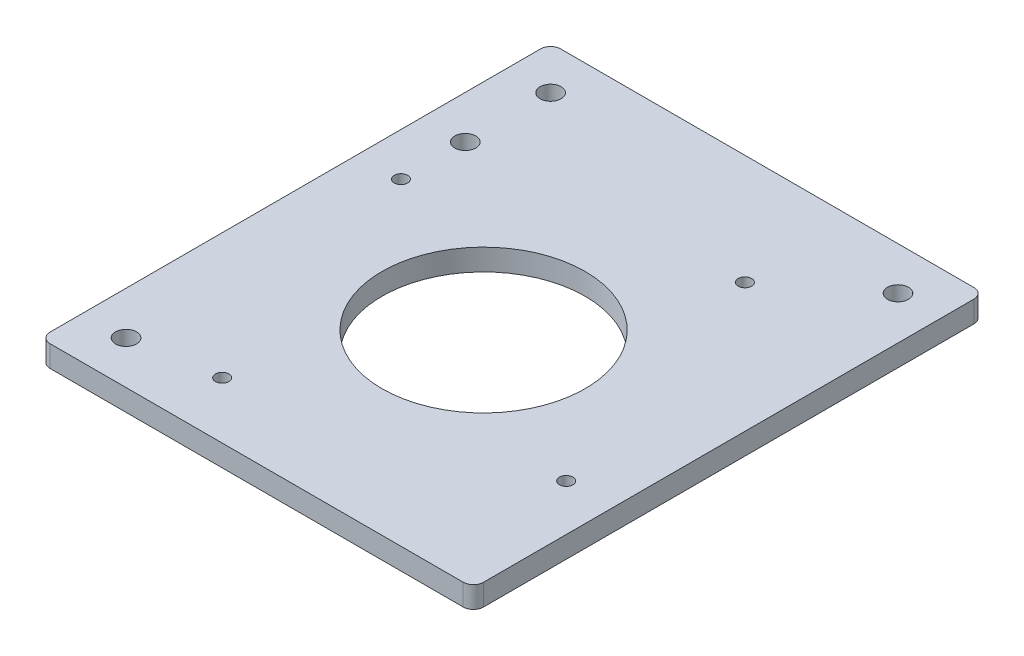
ISO-10303-21;
HEADER;
FILE_DESCRIPTION(('STEP AP214'),'2;1');
FILE_NAME('part.step','',(''),(''),'','','');
FILE_SCHEMA(('AUTOMOTIVE_DESIGN { 1 0 10303 214 1 1 1 1 }'));
ENDSEC;
DATA;
#1=APPLICATION_CONTEXT('core data for automotive mechanical design processes');
#2=APPLICATION_PROTOCOL_DEFINITION('international standard','automotive_design',2000,#1);
#3=PRODUCT_CONTEXT('',#1,'mechanical');
#4=PRODUCT('Part','Part','',(#3));
#5=PRODUCT_RELATED_PRODUCT_CATEGORY('part','',(#4));
#6=PRODUCT_DEFINITION_FORMATION('','',#4);
#7=PRODUCT_DEFINITION_CONTEXT('part definition',#1,'design');
#8=PRODUCT_DEFINITION('design','',#6,#7);
#9=PRODUCT_DEFINITION_SHAPE('','',#8);
#10=(LENGTH_UNIT() NAMED_UNIT(*) SI_UNIT(.MILLI.,.METRE.));
#11=(NAMED_UNIT(*) PLANE_ANGLE_UNIT() SI_UNIT($,.RADIAN.));
#12=(NAMED_UNIT(*) SI_UNIT($,.STERADIAN.) SOLID_ANGLE_UNIT());
#13=UNCERTAINTY_MEASURE_WITH_UNIT(LENGTH_MEASURE(1.E-05),#10,'distance_accuracy_value','');
#14=(GEOMETRIC_REPRESENTATION_CONTEXT(3) GLOBAL_UNCERTAINTY_ASSIGNED_CONTEXT((#13)) GLOBAL_UNIT_ASSIGNED_CONTEXT((#10,
#11,#12)) REPRESENTATION_CONTEXT('',''));
#15=CARTESIAN_POINT('',(0.,0.,0.));
#16=DIRECTION('',(0.,0.,1.));
#17=DIRECTION('',(1.,0.,0.));
#18=AXIS2_PLACEMENT_3D('',#15,#16,#17);
#19=CARTESIAN_POINT('',(0.,6.35,0.));
#20=DIRECTION('',(0.,1.,0.));
#21=DIRECTION('',(0.,0.,1.));
#22=AXIS2_PLACEMENT_3D('',#19,#20,#21);
#23=PLANE('',#22);
#24=CARTESIAN_POINT('',(103.020909069294,6.35,502.462051650958));
#25=DIRECTION('',(0.,1.,0.));
#26=DIRECTION('',(0.,0.,1.));
#27=AXIS2_PLACEMENT_3D('',#24,#25,#26);
#28=CIRCLE('',#27,1.985);
#29=CARTESIAN_POINT('',(103.020909069294,6.35,504.447051650958));
#30=VERTEX_POINT('',#29);
#31=EDGE_CURVE('E233',#30,#30,#28,.T.);
#32=ORIENTED_EDGE('',*,*,#31,.F.);
#33=EDGE_LOOP('',(#32));
#34=FACE_BOUND('',#33,.T.);
#35=CARTESIAN_POINT('',(127.427334093555,6.35,579.6556266267));
#36=DIRECTION('',(0.,1.,0.));
#37=DIRECTION('',(0.,0.,1.));
#38=AXIS2_PLACEMENT_3D('',#35,#36,#37);
#39=CIRCLE('',#38,1.985);
#40=CARTESIAN_POINT('',(127.427334093555,6.35,581.6406266267));
#41=VERTEX_POINT('',#40);
#42=EDGE_CURVE('E230',#41,#41,#39,.T.);
#43=ORIENTED_EDGE('',*,*,#42,.F.);
#44=EDGE_LOOP('',(#43));
#45=FACE_BOUND('',#44,.T.);
#46=CARTESIAN_POINT('',(50.2337591178136,6.35,604.06205165096));
#47=DIRECTION('',(0.,1.,0.));
#48=DIRECTION('',(0.,0.,1.));
#49=AXIS2_PLACEMENT_3D('',#46,#47,#48);
#50=CIRCLE('',#49,1.98500000000001);
#51=CARTESIAN_POINT('',(50.2337591178136,6.35,606.04705165096));
#52=VERTEX_POINT('',#51);
#53=EDGE_CURVE('E224',#52,#52,#50,.T.);
#54=ORIENTED_EDGE('',*,*,#53,.F.);
#55=EDGE_LOOP('',(#54));
#56=FACE_BOUND('',#55,.T.);
#57=CARTESIAN_POINT('',(25.8273340935529,6.35,526.868476675219));
#58=DIRECTION('',(0.,1.,0.));
#59=DIRECTION('',(0.,0.,1.));
#60=AXIS2_PLACEMENT_3D('',#57,#58,#59);
#61=CIRCLE('',#60,1.98500000000001);
#62=CARTESIAN_POINT('',(25.8273340935529,6.35,528.853476675219));
#63=VERTEX_POINT('',#62);
#64=EDGE_CURVE('E218',#63,#63,#61,.T.);
#65=ORIENTED_EDGE('',*,*,#64,.F.);
#66=EDGE_LOOP('',(#65));
#67=FACE_BOUND('',#66,.T.);
#68=CARTESIAN_POINT('',(25.8273340935529,6.35,608.062051650959));
#69=DIRECTION('',(0.,1.,0.));
#70=DIRECTION('',(0.,0.,1.));
#71=AXIS2_PLACEMENT_3D('',#68,#69,#70);
#72=CIRCLE('',#71,3.10000000000002);
#73=CARTESIAN_POINT('',(25.8273340935529,6.35,611.162051650959));
#74=VERTEX_POINT('',#73);
#75=EDGE_CURVE('E200',#74,#74,#72,.T.);
#76=ORIENTED_EDGE('',*,*,#75,.F.);
#77=EDGE_LOOP('',(#76));
#78=FACE_BOUND('',#77,.T.);
#79=CARTESIAN_POINT('',(25.8273340935529,6.35,482.662051650959));
#80=DIRECTION('',(0.,1.,0.));
#81=DIRECTION('',(0.,0.,1.));
#82=AXIS2_PLACEMENT_3D('',#79,#80,#81);
#83=CIRCLE('',#82,3.1);
#84=CARTESIAN_POINT('',(25.8273340935529,6.35,485.762051650959));
#85=VERTEX_POINT('',#84);
#86=EDGE_CURVE('E188',#85,#85,#83,.T.);
#87=ORIENTED_EDGE('',*,*,#86,.F.);
#88=EDGE_LOOP('',(#87));
#89=FACE_BOUND('',#88,.T.);
#90=DIRECTION('',(0.,0.,-1.));
#91=VECTOR('',#90,1.);
#92=CARTESIAN_POINT('',(141.127334093553,6.35,469.962051650959));
#93=LINE('',#92,#91);
#94=CARTESIAN_POINT('',(141.127334093553,6.35,617.762051650959));
#95=VERTEX_POINT('',#94);
#96=CARTESIAN_POINT('',(141.127334093553,6.35,472.962051650959));
#97=VERTEX_POINT('',#96);
#98=EDGE_CURVE('E145',#95,#97,#93,.T.);
#99=ORIENTED_EDGE('',*,*,#98,.T.);
#100=CARTESIAN_POINT('',(138.127334093553,6.35,472.962051650959));
#101=DIRECTION('',(0.,1.,0.));
#102=DIRECTION('',(0.,0.,1.));
#103=AXIS2_PLACEMENT_3D('',#100,#101,#102);
#104=CIRCLE('',#103,3.);
#105=CARTESIAN_POINT('',(138.127334093553,6.35,469.962051650959));
#106=VERTEX_POINT('',#105);
#107=EDGE_CURVE('E160',#97,#106,#104,.T.);
#108=ORIENTED_EDGE('',*,*,#107,.T.);
#109=DIRECTION('',(-1.,0.,0.));
#110=VECTOR('',#109,1.);
#111=CARTESIAN_POINT('',(13.127334093553,6.35,469.962051650959));
#112=LINE('',#111,#110);
#113=CARTESIAN_POINT('',(16.127334093553,6.35,469.962051650959));
#114=VERTEX_POINT('',#113);
#115=EDGE_CURVE('E127',#106,#114,#112,.T.);
#116=ORIENTED_EDGE('',*,*,#115,.T.);
#117=CARTESIAN_POINT('',(16.127334093553,6.35,472.962051650959));
#118=DIRECTION('',(0.,1.,0.));
#119=DIRECTION('',(0.,0.,1.));
#120=AXIS2_PLACEMENT_3D('',#117,#118,#119);
#121=CIRCLE('',#120,3.);
#122=CARTESIAN_POINT('',(13.127334093553,6.35,472.962051650959));
#123=VERTEX_POINT('',#122);
#124=EDGE_CURVE('E155',#114,#123,#121,.T.);
#125=ORIENTED_EDGE('',*,*,#124,.T.);
#126=DIRECTION('',(0.,0.,1.));
#127=VECTOR('',#126,1.);
#128=CARTESIAN_POINT('',(13.127334093553,6.35,469.962051650959));
#129=LINE('',#128,#127);
#130=CARTESIAN_POINT('',(13.127334093553,6.35,617.762051650959));
#131=VERTEX_POINT('',#130);
#132=EDGE_CURVE('E171',#123,#131,#129,.T.);
#133=ORIENTED_EDGE('',*,*,#132,.T.);
#134=CARTESIAN_POINT('',(16.127334093553,6.35,617.762051650959));
#135=DIRECTION('',(0.,1.,0.));
#136=DIRECTION('',(0.,0.,1.));
#137=AXIS2_PLACEMENT_3D('',#134,#135,#136);
#138=CIRCLE('',#137,3.);
#139=CARTESIAN_POINT('',(16.127334093553,6.35,620.762051650959));
#140=VERTEX_POINT('',#139);
#141=EDGE_CURVE('E63',#131,#140,#138,.T.);
#142=ORIENTED_EDGE('',*,*,#141,.T.);
#143=DIRECTION('',(1.,0.,0.));
#144=VECTOR('',#143,1.);
#145=CARTESIAN_POINT('',(13.127334093553,6.35,620.762051650959));
#146=LINE('',#145,#144);
#147=CARTESIAN_POINT('',(138.127334093553,6.35,620.762051650959));
#148=VERTEX_POINT('',#147);
#149=EDGE_CURVE('E146',#140,#148,#146,.T.);
#150=ORIENTED_EDGE('',*,*,#149,.T.);
#151=CARTESIAN_POINT('',(138.127334093553,6.35,617.762051650959));
#152=DIRECTION('',(0.,1.,0.));
#153=DIRECTION('',(0.,0.,1.));
#154=AXIS2_PLACEMENT_3D('',#151,#152,#153);
#155=CIRCLE('',#154,3.);
#156=EDGE_CURVE('E158',#148,#95,#155,.T.);
#157=ORIENTED_EDGE('',*,*,#156,.T.);
#158=EDGE_LOOP('',(#99,#108,#116,#125,#133,#142,#150,#157));
#159=FACE_BOUND('',#158,.T.);
#160=CARTESIAN_POINT('',(76.6273340935538,6.35,553.262051650959));
#161=DIRECTION('',(0.,1.,0.));
#162=DIRECTION('',(0.,0.,1.));
#163=AXIS2_PLACEMENT_3D('',#160,#161,#162);
#164=CIRCLE('',#163,30.);
#165=CARTESIAN_POINT('',(76.6273340935538,6.35,583.262051650959));
#166=VERTEX_POINT('',#165);
#167=EDGE_CURVE('E140',#166,#166,#164,.T.);
#168=ORIENTED_EDGE('',*,*,#167,.F.);
#169=EDGE_LOOP('',(#168));
#170=FACE_BOUND('',#169,.T.);
#171=CARTESIAN_POINT('',(128.427334093553,6.35,482.662051650959));
#172=DIRECTION('',(0.,1.,0.));
#173=DIRECTION('',(0.,0.,1.));
#174=AXIS2_PLACEMENT_3D('',#171,#172,#173);
#175=CIRCLE('',#174,3.09999999999999);
#176=CARTESIAN_POINT('',(128.427334093553,6.35,485.762051650959));
#177=VERTEX_POINT('',#176);
#178=EDGE_CURVE('E194',#177,#177,#175,.T.);
#179=ORIENTED_EDGE('',*,*,#178,.F.);
#180=EDGE_LOOP('',(#179));
#181=FACE_BOUND('',#180,.T.);
#182=CARTESIAN_POINT('',(25.8273340935529,6.35,507.862051650959));
#183=DIRECTION('',(0.,1.,0.));
#184=DIRECTION('',(0.,0.,1.));
#185=AXIS2_PLACEMENT_3D('',#182,#183,#184);
#186=CIRCLE('',#185,3.1);
#187=CARTESIAN_POINT('',(25.8273340935529,6.35,510.962051650959));
#188=VERTEX_POINT('',#187);
#189=EDGE_CURVE('E206',#188,#188,#186,.T.);
#190=ORIENTED_EDGE('',*,*,#189,.F.);
#191=EDGE_LOOP('',(#190));
#192=FACE_BOUND('',#191,.T.);
#193=ADVANCED_FACE('F41',(#34,#45,#56,#67,#78,#89,#159,#170,#181,#192),#23,.T.);
#194=CARTESIAN_POINT('',(0.,0.,0.));
#195=DIRECTION('',(0.,1.,0.));
#196=DIRECTION('',(0.,0.,1.));
#197=AXIS2_PLACEMENT_3D('',#194,#195,#196);
#198=PLANE('',#197);
#199=CARTESIAN_POINT('',(103.020909069294,0.,502.462051650958));
#200=DIRECTION('',(0.,1.,0.));
#201=DIRECTION('',(0.,0.,1.));
#202=AXIS2_PLACEMENT_3D('',#199,#200,#201);
#203=CIRCLE('',#202,1.985);
#204=CARTESIAN_POINT('',(103.020909069294,0.,504.447051650958));
#205=VERTEX_POINT('',#204);
#206=EDGE_CURVE('E212',#205,#205,#203,.T.);
#207=ORIENTED_EDGE('',*,*,#206,.T.);
#208=EDGE_LOOP('',(#207));
#209=FACE_BOUND('',#208,.T.);
#210=CARTESIAN_POINT('',(127.427334093555,0.,579.6556266267));
#211=DIRECTION('',(0.,1.,0.));
#212=DIRECTION('',(0.,0.,1.));
#213=AXIS2_PLACEMENT_3D('',#210,#211,#212);
#214=CIRCLE('',#213,1.985);
#215=CARTESIAN_POINT('',(127.427334093555,0.,581.6406266267));
#216=VERTEX_POINT('',#215);
#217=EDGE_CURVE('E227',#216,#216,#214,.T.);
#218=ORIENTED_EDGE('',*,*,#217,.T.);
#219=EDGE_LOOP('',(#218));
#220=FACE_BOUND('',#219,.T.);
#221=CARTESIAN_POINT('',(50.2337591178136,0.,604.06205165096));
#222=DIRECTION('',(0.,1.,0.));
#223=DIRECTION('',(0.,0.,1.));
#224=AXIS2_PLACEMENT_3D('',#221,#222,#223);
#225=CIRCLE('',#224,1.98500000000001);
#226=CARTESIAN_POINT('',(50.2337591178136,0.,606.04705165096));
#227=VERTEX_POINT('',#226);
#228=EDGE_CURVE('E221',#227,#227,#225,.T.);
#229=ORIENTED_EDGE('',*,*,#228,.T.);
#230=EDGE_LOOP('',(#229));
#231=FACE_BOUND('',#230,.T.);
#232=CARTESIAN_POINT('',(25.8273340935529,0.,526.868476675219));
#233=DIRECTION('',(0.,1.,0.));
#234=DIRECTION('',(0.,0.,1.));
#235=AXIS2_PLACEMENT_3D('',#232,#233,#234);
#236=CIRCLE('',#235,1.98500000000001);
#237=CARTESIAN_POINT('',(25.8273340935529,0.,528.853476675219));
#238=VERTEX_POINT('',#237);
#239=EDGE_CURVE('E215',#238,#238,#236,.T.);
#240=ORIENTED_EDGE('',*,*,#239,.T.);
#241=EDGE_LOOP('',(#240));
#242=FACE_BOUND('',#241,.T.);
#243=DIRECTION('',(-1.,0.,0.));
#244=VECTOR('',#243,1.);
#245=CARTESIAN_POINT('',(13.127334093553,0.,469.962051650959));
#246=LINE('',#245,#244);
#247=CARTESIAN_POINT('',(138.127334093553,0.,469.962051650959));
#248=VERTEX_POINT('',#247);
#249=CARTESIAN_POINT('',(16.127334093553,0.,469.962051650959));
#250=VERTEX_POINT('',#249);
#251=EDGE_CURVE('E124',#248,#250,#246,.T.);
#252=ORIENTED_EDGE('',*,*,#251,.F.);
#253=CARTESIAN_POINT('',(138.127334093553,0.,472.962051650959));
#254=DIRECTION('',(0.,1.,0.));
#255=DIRECTION('',(0.,0.,1.));
#256=AXIS2_PLACEMENT_3D('',#253,#254,#255);
#257=CIRCLE('',#256,3.);
#258=CARTESIAN_POINT('',(141.127334093553,0.,472.962051650959));
#259=VERTEX_POINT('',#258);
#260=EDGE_CURVE('E107',#248,#259,#257,.F.);
#261=ORIENTED_EDGE('',*,*,#260,.T.);
#262=DIRECTION('',(0.,0.,-1.));
#263=VECTOR('',#262,1.);
#264=CARTESIAN_POINT('',(141.127334093553,0.,469.962051650959));
#265=LINE('',#264,#263);
#266=CARTESIAN_POINT('',(141.127334093553,0.,617.762051650959));
#267=VERTEX_POINT('',#266);
#268=EDGE_CURVE('E135',#267,#259,#265,.T.);
#269=ORIENTED_EDGE('',*,*,#268,.F.);
#270=CARTESIAN_POINT('',(138.127334093553,0.,617.762051650959));
#271=DIRECTION('',(0.,1.,0.));
#272=DIRECTION('',(0.,0.,1.));
#273=AXIS2_PLACEMENT_3D('',#270,#271,#272);
#274=CIRCLE('',#273,3.);
#275=CARTESIAN_POINT('',(138.127334093553,0.,620.762051650959));
#276=VERTEX_POINT('',#275);
#277=EDGE_CURVE('E118',#267,#276,#274,.F.);
#278=ORIENTED_EDGE('',*,*,#277,.T.);
#279=DIRECTION('',(1.,0.,0.));
#280=VECTOR('',#279,1.);
#281=CARTESIAN_POINT('',(13.127334093553,0.,620.762051650959));
#282=LINE('',#281,#280);
#283=CARTESIAN_POINT('',(16.127334093553,0.,620.762051650959));
#284=VERTEX_POINT('',#283);
#285=EDGE_CURVE('E138',#284,#276,#282,.T.);
#286=ORIENTED_EDGE('',*,*,#285,.F.);
#287=CARTESIAN_POINT('',(16.127334093553,0.,617.762051650959));
#288=DIRECTION('',(0.,1.,0.));
#289=DIRECTION('',(0.,0.,1.));
#290=AXIS2_PLACEMENT_3D('',#287,#288,#289);
#291=CIRCLE('',#290,3.);
#292=CARTESIAN_POINT('',(13.127334093553,0.,617.762051650959));
#293=VERTEX_POINT('',#292);
#294=EDGE_CURVE('E149',#284,#293,#291,.F.);
#295=ORIENTED_EDGE('',*,*,#294,.T.);
#296=DIRECTION('',(0.,0.,1.));
#297=VECTOR('',#296,1.);
#298=CARTESIAN_POINT('',(13.127334093553,0.,469.962051650959));
#299=LINE('',#298,#297);
#300=CARTESIAN_POINT('',(13.127334093553,0.,472.962051650959));
#301=VERTEX_POINT('',#300);
#302=EDGE_CURVE('E134',#301,#293,#299,.T.);
#303=ORIENTED_EDGE('',*,*,#302,.F.);
#304=CARTESIAN_POINT('',(16.127334093553,0.,472.962051650959));
#305=DIRECTION('',(0.,1.,0.));
#306=DIRECTION('',(0.,0.,1.));
#307=AXIS2_PLACEMENT_3D('',#304,#305,#306);
#308=CIRCLE('',#307,3.);
#309=EDGE_CURVE('E128',#301,#250,#308,.F.);
#310=ORIENTED_EDGE('',*,*,#309,.T.);
#311=EDGE_LOOP('',(#252,#261,#269,#278,#286,#295,#303,#310));
#312=FACE_BOUND('',#311,.T.);
#313=CARTESIAN_POINT('',(76.6273340935538,0.,553.262051650959));
#314=DIRECTION('',(0.,1.,0.));
#315=DIRECTION('',(0.,0.,1.));
#316=AXIS2_PLACEMENT_3D('',#313,#314,#315);
#317=CIRCLE('',#316,30.);
#318=CARTESIAN_POINT('',(76.6273340935538,0.,583.262051650959));
#319=VERTEX_POINT('',#318);
#320=EDGE_CURVE('E185',#319,#319,#317,.T.);
#321=ORIENTED_EDGE('',*,*,#320,.T.);
#322=EDGE_LOOP('',(#321));
#323=FACE_BOUND('',#322,.T.);
#324=CARTESIAN_POINT('',(25.8273340935529,0.,482.662051650959));
#325=DIRECTION('',(0.,1.,0.));
#326=DIRECTION('',(0.,0.,1.));
#327=AXIS2_PLACEMENT_3D('',#324,#325,#326);
#328=CIRCLE('',#327,3.1);
#329=CARTESIAN_POINT('',(25.8273340935529,0.,485.762051650959));
#330=VERTEX_POINT('',#329);
#331=EDGE_CURVE('E191',#330,#330,#328,.T.);
#332=ORIENTED_EDGE('',*,*,#331,.T.);
#333=EDGE_LOOP('',(#332));
#334=FACE_BOUND('',#333,.T.);
#335=CARTESIAN_POINT('',(128.427334093553,0.,482.662051650959));
#336=DIRECTION('',(0.,1.,0.));
#337=DIRECTION('',(0.,0.,1.));
#338=AXIS2_PLACEMENT_3D('',#335,#336,#337);
#339=CIRCLE('',#338,3.09999999999999);
#340=CARTESIAN_POINT('',(128.427334093553,0.,485.762051650959));
#341=VERTEX_POINT('',#340);
#342=EDGE_CURVE('E197',#341,#341,#339,.T.);
#343=ORIENTED_EDGE('',*,*,#342,.T.);
#344=EDGE_LOOP('',(#343));
#345=FACE_BOUND('',#344,.T.);
#346=CARTESIAN_POINT('',(25.8273340935529,0.,608.062051650959));
#347=DIRECTION('',(0.,1.,0.));
#348=DIRECTION('',(0.,0.,1.));
#349=AXIS2_PLACEMENT_3D('',#346,#347,#348);
#350=CIRCLE('',#349,3.10000000000002);
#351=CARTESIAN_POINT('',(25.8273340935529,0.,611.162051650959));
#352=VERTEX_POINT('',#351);
#353=EDGE_CURVE('E203',#352,#352,#350,.T.);
#354=ORIENTED_EDGE('',*,*,#353,.T.);
#355=EDGE_LOOP('',(#354));
#356=FACE_BOUND('',#355,.T.);
#357=CARTESIAN_POINT('',(25.8273340935529,0.,507.862051650959));
#358=DIRECTION('',(0.,1.,0.));
#359=DIRECTION('',(0.,0.,1.));
#360=AXIS2_PLACEMENT_3D('',#357,#358,#359);
#361=CIRCLE('',#360,3.1);
#362=CARTESIAN_POINT('',(25.8273340935529,0.,510.962051650959));
#363=VERTEX_POINT('',#362);
#364=EDGE_CURVE('E209',#363,#363,#361,.T.);
#365=ORIENTED_EDGE('',*,*,#364,.T.);
#366=EDGE_LOOP('',(#365));
#367=FACE_BOUND('',#366,.T.);
#368=ADVANCED_FACE('F131',(#209,#220,#231,#242,#312,#323,#334,#345,#356,#367),#198,.F.);
#369=CARTESIAN_POINT('',(141.127334093553,6.35,469.962051650959));
#370=DIRECTION('',(-1.,0.,0.));
#371=DIRECTION('',(0.,0.,1.));
#372=AXIS2_PLACEMENT_3D('',#369,#370,#371);
#373=PLANE('',#372);
#374=ORIENTED_EDGE('',*,*,#268,.T.);
#375=DIRECTION('',(0.,-1.,0.));
#376=VECTOR('',#375,1.);
#377=CARTESIAN_POINT('',(141.127334093553,6.35,472.962051650959));
#378=LINE('',#377,#376);
#379=EDGE_CURVE('E112',#259,#97,#378,.F.);
#380=ORIENTED_EDGE('',*,*,#379,.T.);
#381=ORIENTED_EDGE('',*,*,#98,.F.);
#382=DIRECTION('',(0.,-1.,0.));
#383=VECTOR('',#382,1.);
#384=CARTESIAN_POINT('',(141.127334093553,6.35,617.762051650959));
#385=LINE('',#384,#383);
#386=EDGE_CURVE('E117',#95,#267,#385,.T.);
#387=ORIENTED_EDGE('',*,*,#386,.T.);
#388=EDGE_LOOP('',(#374,#380,#381,#387));
#389=FACE_BOUND('',#388,.T.);
#390=ADVANCED_FACE('F276',(#389),#373,.F.);
#391=CARTESIAN_POINT('',(13.127334093553,6.35,469.962051650959));
#392=DIRECTION('',(0.,0.,1.));
#393=DIRECTION('',(1.,0.,0.));
#394=AXIS2_PLACEMENT_3D('',#391,#392,#393);
#395=PLANE('',#394);
#396=ORIENTED_EDGE('',*,*,#115,.F.);
#397=DIRECTION('',(0.,-1.,0.));
#398=VECTOR('',#397,1.);
#399=CARTESIAN_POINT('',(138.127334093553,6.35,469.962051650959));
#400=LINE('',#399,#398);
#401=EDGE_CURVE('E111',#106,#248,#400,.T.);
#402=ORIENTED_EDGE('',*,*,#401,.T.);
#403=ORIENTED_EDGE('',*,*,#251,.T.);
#404=DIRECTION('',(0.,-1.,0.));
#405=VECTOR('',#404,1.);
#406=CARTESIAN_POINT('',(16.127334093553,6.35,469.962051650959));
#407=LINE('',#406,#405);
#408=EDGE_CURVE('E129',#250,#114,#407,.F.);
#409=ORIENTED_EDGE('',*,*,#408,.T.);
#410=EDGE_LOOP('',(#396,#402,#403,#409));
#411=FACE_BOUND('',#410,.T.);
#412=ADVANCED_FACE('F123',(#411),#395,.F.);
#413=CARTESIAN_POINT('',(13.127334093553,6.35,469.962051650959));
#414=DIRECTION('',(1.,0.,0.));
#415=DIRECTION('',(0.,0.,-1.));
#416=AXIS2_PLACEMENT_3D('',#413,#414,#415);
#417=PLANE('',#416);
#418=ORIENTED_EDGE('',*,*,#302,.T.);
#419=DIRECTION('',(0.,-1.,0.));
#420=VECTOR('',#419,1.);
#421=CARTESIAN_POINT('',(13.127334093553,6.35,617.762051650959));
#422=LINE('',#421,#420);
#423=EDGE_CURVE('E11',#293,#131,#422,.F.);
#424=ORIENTED_EDGE('',*,*,#423,.T.);
#425=ORIENTED_EDGE('',*,*,#132,.F.);
#426=DIRECTION('',(0.,-1.,0.));
#427=VECTOR('',#426,1.);
#428=CARTESIAN_POINT('',(13.127334093553,6.35,472.962051650959));
#429=LINE('',#428,#427);
#430=EDGE_CURVE('E49',#123,#301,#429,.T.);
#431=ORIENTED_EDGE('',*,*,#430,.T.);
#432=EDGE_LOOP('',(#418,#424,#425,#431));
#433=FACE_BOUND('',#432,.T.);
#434=ADVANCED_FACE('F169',(#433),#417,.F.);
#435=CARTESIAN_POINT('',(13.127334093553,6.35,620.762051650959));
#436=DIRECTION('',(0.,0.,-1.));
#437=DIRECTION('',(-1.,0.,0.));
#438=AXIS2_PLACEMENT_3D('',#435,#436,#437);
#439=PLANE('',#438);
#440=ORIENTED_EDGE('',*,*,#285,.T.);
#441=DIRECTION('',(0.,-1.,0.));
#442=VECTOR('',#441,1.);
#443=CARTESIAN_POINT('',(138.127334093553,6.35,620.762051650959));
#444=LINE('',#443,#442);
#445=EDGE_CURVE('E56',#276,#148,#444,.F.);
#446=ORIENTED_EDGE('',*,*,#445,.T.);
#447=ORIENTED_EDGE('',*,*,#149,.F.);
#448=DIRECTION('',(0.,-1.,0.));
#449=VECTOR('',#448,1.);
#450=CARTESIAN_POINT('',(16.127334093553,6.35,620.762051650959));
#451=LINE('',#450,#449);
#452=EDGE_CURVE('E162',#140,#284,#451,.T.);
#453=ORIENTED_EDGE('',*,*,#452,.T.);
#454=EDGE_LOOP('',(#440,#446,#447,#453));
#455=FACE_BOUND('',#454,.T.);
#456=ADVANCED_FACE('F178',(#455),#439,.F.);
#457=CARTESIAN_POINT('',(76.6273340935538,6.35,553.262051650959));
#458=DIRECTION('',(0.,-1.,0.));
#459=DIRECTION('',(0.,0.,-1.));
#460=AXIS2_PLACEMENT_3D('',#457,#458,#459);
#461=CYLINDRICAL_SURFACE('',#460,30.);
#462=ORIENTED_EDGE('',*,*,#167,.T.);
#463=EDGE_LOOP('',(#462));
#464=FACE_BOUND('',#463,.T.);
#465=ORIENTED_EDGE('',*,*,#320,.F.);
#466=EDGE_LOOP('',(#465));
#467=FACE_BOUND('',#466,.T.);
#468=ADVANCED_FACE('F288',(#464,#467),#461,.F.);
#469=CARTESIAN_POINT('',(25.8273340935529,6.35,482.662051650959));
#470=DIRECTION('',(0.,-1.,0.));
#471=DIRECTION('',(0.,0.,-1.));
#472=AXIS2_PLACEMENT_3D('',#469,#470,#471);
#473=CYLINDRICAL_SURFACE('',#472,3.1);
#474=ORIENTED_EDGE('',*,*,#86,.T.);
#475=EDGE_LOOP('',(#474));
#476=FACE_BOUND('',#475,.T.);
#477=ORIENTED_EDGE('',*,*,#331,.F.);
#478=EDGE_LOOP('',(#477));
#479=FACE_BOUND('',#478,.T.);
#480=ADVANCED_FACE('F323',(#476,#479),#473,.F.);
#481=CARTESIAN_POINT('',(128.427334093553,6.35,482.662051650959));
#482=DIRECTION('',(0.,-1.,0.));
#483=DIRECTION('',(0.,0.,-1.));
#484=AXIS2_PLACEMENT_3D('',#481,#482,#483);
#485=CYLINDRICAL_SURFACE('',#484,3.09999999999999);
#486=ORIENTED_EDGE('',*,*,#178,.T.);
#487=EDGE_LOOP('',(#486));
#488=FACE_BOUND('',#487,.T.);
#489=ORIENTED_EDGE('',*,*,#342,.F.);
#490=EDGE_LOOP('',(#489));
#491=FACE_BOUND('',#490,.T.);
#492=ADVANCED_FACE('F319',(#488,#491),#485,.F.);
#493=CARTESIAN_POINT('',(25.8273340935529,6.35,608.062051650959));
#494=DIRECTION('',(0.,-1.,0.));
#495=DIRECTION('',(0.,0.,-1.));
#496=AXIS2_PLACEMENT_3D('',#493,#494,#495);
#497=CYLINDRICAL_SURFACE('',#496,3.10000000000002);
#498=ORIENTED_EDGE('',*,*,#75,.T.);
#499=EDGE_LOOP('',(#498));
#500=FACE_BOUND('',#499,.T.);
#501=ORIENTED_EDGE('',*,*,#353,.F.);
#502=EDGE_LOOP('',(#501));
#503=FACE_BOUND('',#502,.T.);
#504=ADVANCED_FACE('F271',(#500,#503),#497,.F.);
#505=CARTESIAN_POINT('',(25.8273340935529,6.35,507.862051650959));
#506=DIRECTION('',(0.,-1.,0.));
#507=DIRECTION('',(0.,0.,-1.));
#508=AXIS2_PLACEMENT_3D('',#505,#506,#507);
#509=CYLINDRICAL_SURFACE('',#508,3.1);
#510=ORIENTED_EDGE('',*,*,#189,.T.);
#511=EDGE_LOOP('',(#510));
#512=FACE_BOUND('',#511,.T.);
#513=ORIENTED_EDGE('',*,*,#364,.F.);
#514=EDGE_LOOP('',(#513));
#515=FACE_BOUND('',#514,.T.);
#516=ADVANCED_FACE('F268',(#512,#515),#509,.F.);
#517=CARTESIAN_POINT('',(138.127334093553,6.35,472.962051650959));
#518=DIRECTION('',(0.,-1.,0.));
#519=DIRECTION('',(0.,0.,-1.));
#520=AXIS2_PLACEMENT_3D('',#517,#518,#519);
#521=CYLINDRICAL_SURFACE('',#520,3.);
#522=ORIENTED_EDGE('',*,*,#107,.F.);
#523=ORIENTED_EDGE('',*,*,#379,.F.);
#524=ORIENTED_EDGE('',*,*,#260,.F.);
#525=ORIENTED_EDGE('',*,*,#401,.F.);
#526=EDGE_LOOP('',(#522,#523,#524,#525));
#527=FACE_BOUND('',#526,.T.);
#528=ADVANCED_FACE('F110',(#527),#521,.T.);
#529=CARTESIAN_POINT('',(138.127334093553,6.35,617.762051650959));
#530=DIRECTION('',(0.,-1.,0.));
#531=DIRECTION('',(0.,0.,-1.));
#532=AXIS2_PLACEMENT_3D('',#529,#530,#531);
#533=CYLINDRICAL_SURFACE('',#532,3.);
#534=ORIENTED_EDGE('',*,*,#156,.F.);
#535=ORIENTED_EDGE('',*,*,#445,.F.);
#536=ORIENTED_EDGE('',*,*,#277,.F.);
#537=ORIENTED_EDGE('',*,*,#386,.F.);
#538=EDGE_LOOP('',(#534,#535,#536,#537));
#539=FACE_BOUND('',#538,.T.);
#540=ADVANCED_FACE('F295',(#539),#533,.T.);
#541=CARTESIAN_POINT('',(16.127334093553,6.35,617.762051650959));
#542=DIRECTION('',(0.,-1.,0.));
#543=DIRECTION('',(0.,0.,-1.));
#544=AXIS2_PLACEMENT_3D('',#541,#542,#543);
#545=CYLINDRICAL_SURFACE('',#544,3.);
#546=ORIENTED_EDGE('',*,*,#141,.F.);
#547=ORIENTED_EDGE('',*,*,#423,.F.);
#548=ORIENTED_EDGE('',*,*,#294,.F.);
#549=ORIENTED_EDGE('',*,*,#452,.F.);
#550=EDGE_LOOP('',(#546,#547,#548,#549));
#551=FACE_BOUND('',#550,.T.);
#552=ADVANCED_FACE('F177',(#551),#545,.T.);
#553=CARTESIAN_POINT('',(16.127334093553,6.35,472.962051650959));
#554=DIRECTION('',(0.,-1.,0.));
#555=DIRECTION('',(0.,0.,-1.));
#556=AXIS2_PLACEMENT_3D('',#553,#554,#555);
#557=CYLINDRICAL_SURFACE('',#556,3.);
#558=ORIENTED_EDGE('',*,*,#124,.F.);
#559=ORIENTED_EDGE('',*,*,#408,.F.);
#560=ORIENTED_EDGE('',*,*,#309,.F.);
#561=ORIENTED_EDGE('',*,*,#430,.F.);
#562=EDGE_LOOP('',(#558,#559,#560,#561));
#563=FACE_BOUND('',#562,.T.);
#564=ADVANCED_FACE('F43',(#563),#557,.T.);
#565=CARTESIAN_POINT('',(25.8273340935529,0.,526.868476675219));
#566=DIRECTION('',(0.,1.,0.));
#567=DIRECTION('',(0.,0.,1.));
#568=AXIS2_PLACEMENT_3D('',#565,#566,#567);
#569=CYLINDRICAL_SURFACE('',#568,1.98500000000001);
#570=ORIENTED_EDGE('',*,*,#239,.F.);
#571=EDGE_LOOP('',(#570));
#572=FACE_BOUND('',#571,.T.);
#573=ORIENTED_EDGE('',*,*,#64,.T.);
#574=EDGE_LOOP('',(#573));
#575=FACE_BOUND('',#574,.T.);
#576=ADVANCED_FACE('F302',(#572,#575),#569,.F.);
#577=CARTESIAN_POINT('',(50.2337591178136,0.,604.06205165096));
#578=DIRECTION('',(0.,1.,0.));
#579=DIRECTION('',(0.,0.,1.));
#580=AXIS2_PLACEMENT_3D('',#577,#578,#579);
#581=CYLINDRICAL_SURFACE('',#580,1.98500000000001);
#582=ORIENTED_EDGE('',*,*,#228,.F.);
#583=EDGE_LOOP('',(#582));
#584=FACE_BOUND('',#583,.T.);
#585=ORIENTED_EDGE('',*,*,#53,.T.);
#586=EDGE_LOOP('',(#585));
#587=FACE_BOUND('',#586,.T.);
#588=ADVANCED_FACE('F305',(#584,#587),#581,.F.);
#589=CARTESIAN_POINT('',(127.427334093555,0.,579.6556266267));
#590=DIRECTION('',(0.,1.,0.));
#591=DIRECTION('',(0.,0.,1.));
#592=AXIS2_PLACEMENT_3D('',#589,#590,#591);
#593=CYLINDRICAL_SURFACE('',#592,1.985);
#594=ORIENTED_EDGE('',*,*,#217,.F.);
#595=EDGE_LOOP('',(#594));
#596=FACE_BOUND('',#595,.T.);
#597=ORIENTED_EDGE('',*,*,#42,.T.);
#598=EDGE_LOOP('',(#597));
#599=FACE_BOUND('',#598,.T.);
#600=ADVANCED_FACE('F244',(#596,#599),#593,.F.);
#601=CARTESIAN_POINT('',(103.020909069294,0.,502.462051650958));
#602=DIRECTION('',(0.,1.,0.));
#603=DIRECTION('',(0.,0.,1.));
#604=AXIS2_PLACEMENT_3D('',#601,#602,#603);
#605=CYLINDRICAL_SURFACE('',#604,1.985);
#606=ORIENTED_EDGE('',*,*,#206,.F.);
#607=EDGE_LOOP('',(#606));
#608=FACE_BOUND('',#607,.T.);
#609=ORIENTED_EDGE('',*,*,#31,.T.);
#610=EDGE_LOOP('',(#609));
#611=FACE_BOUND('',#610,.T.);
#612=ADVANCED_FACE('F241',(#608,#611),#605,.F.);
#613=CLOSED_SHELL('',(#193,#368,#390,#412,#434,#456,#468,#480,#492,#504,#516,#528,#540,#552,
#564,#576,#588,#600,#612));
#614=MANIFOLD_SOLID_BREP('B2',#613);
#615=ADVANCED_BREP_SHAPE_REPRESENTATION('',(#18,#614),#14);
#616=SHAPE_DEFINITION_REPRESENTATION(#9,#615);
ENDSEC;
END-ISO-10303-21;
